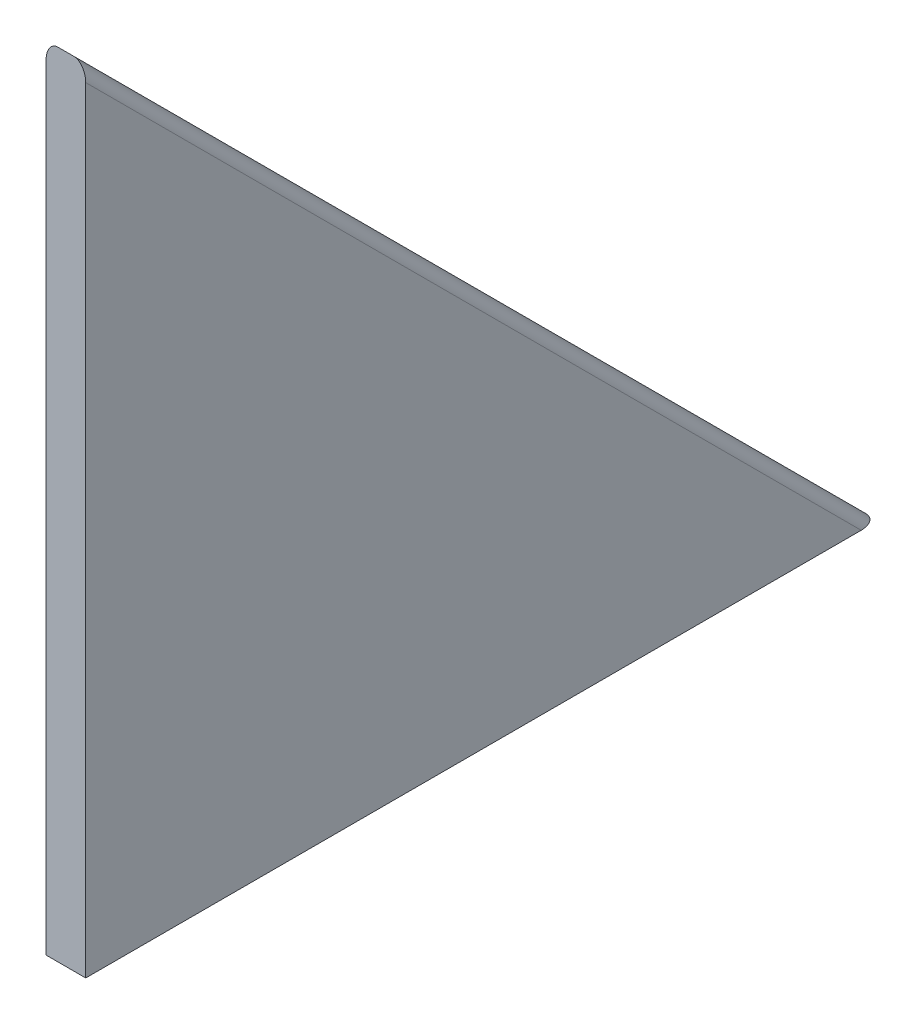
ISO-10303-21;
HEADER;
FILE_DESCRIPTION(('STEP AP214'),'2;1');
FILE_NAME('part.step','',(''),(''),'','','');
FILE_SCHEMA(('AUTOMOTIVE_DESIGN { 1 0 10303 214 1 1 1 1 }'));
ENDSEC;
DATA;
#1=APPLICATION_CONTEXT('core data for automotive mechanical design processes');
#2=APPLICATION_PROTOCOL_DEFINITION('international standard','automotive_design',2000,#1);
#3=PRODUCT_CONTEXT('',#1,'mechanical');
#4=PRODUCT('Part','Part','',(#3));
#5=PRODUCT_RELATED_PRODUCT_CATEGORY('part','',(#4));
#6=PRODUCT_DEFINITION_FORMATION('','',#4);
#7=PRODUCT_DEFINITION_CONTEXT('part definition',#1,'design');
#8=PRODUCT_DEFINITION('design','',#6,#7);
#9=PRODUCT_DEFINITION_SHAPE('','',#8);
#10=(LENGTH_UNIT() NAMED_UNIT(*) SI_UNIT(.MILLI.,.METRE.));
#11=(NAMED_UNIT(*) PLANE_ANGLE_UNIT() SI_UNIT($,.RADIAN.));
#12=(NAMED_UNIT(*) SI_UNIT($,.STERADIAN.) SOLID_ANGLE_UNIT());
#13=UNCERTAINTY_MEASURE_WITH_UNIT(LENGTH_MEASURE(1.E-05),#10,'distance_accuracy_value','');
#14=(GEOMETRIC_REPRESENTATION_CONTEXT(3) GLOBAL_UNCERTAINTY_ASSIGNED_CONTEXT((#13)) GLOBAL_UNIT_ASSIGNED_CONTEXT((#10,
#11,#12)) REPRESENTATION_CONTEXT('',''));
#15=CARTESIAN_POINT('',(0.,0.,0.));
#16=DIRECTION('',(0.,0.,1.));
#17=DIRECTION('',(1.,0.,0.));
#18=AXIS2_PLACEMENT_3D('',#15,#16,#17);
#19=CARTESIAN_POINT('',(-10.,-200.,0.));
#20=DIRECTION('',(0.,0.,1.));
#21=DIRECTION('',(1.,0.,0.));
#22=AXIS2_PLACEMENT_3D('',#19,#20,#21);
#23=PLANE('',#22);
#24=DIRECTION('',(1.,0.,0.));
#25=VECTOR('',#24,1.);
#26=CARTESIAN_POINT('',(-10.,0.,0.));
#27=LINE('',#26,#25);
#28=CARTESIAN_POINT('',(-7.,0.,0.));
#29=VERTEX_POINT('',#28);
#30=CARTESIAN_POINT('',(-3.,0.,0.));
#31=VERTEX_POINT('',#30);
#32=EDGE_CURVE('E120',#29,#31,#27,.T.);
#33=ORIENTED_EDGE('',*,*,#32,.F.);
#34=CARTESIAN_POINT('',(-7.,-4.24264068711929,0.));
#35=DIRECTION('',(0.,0.,1.));
#36=DIRECTION('',(0.,-1.,0.));
#37=AXIS2_PLACEMENT_3D('',#34,#35,#36);
#38=ELLIPSE('',#37,4.24264068711928,3.);
#39=CARTESIAN_POINT('',(-10.,-4.24264068711927,0.));
#40=VERTEX_POINT('',#39);
#41=EDGE_CURVE('E100',#29,#40,#38,.T.);
#42=ORIENTED_EDGE('',*,*,#41,.T.);
#43=DIRECTION('',(0.,-1.,0.));
#44=VECTOR('',#43,1.);
#45=CARTESIAN_POINT('',(-10.,-200.,0.));
#46=LINE('',#45,#44);
#47=CARTESIAN_POINT('',(-10.,-200.,0.));
#48=VERTEX_POINT('',#47);
#49=EDGE_CURVE('E95',#40,#48,#46,.T.);
#50=ORIENTED_EDGE('',*,*,#49,.T.);
#51=DIRECTION('',(1.,0.,0.));
#52=VECTOR('',#51,1.);
#53=CARTESIAN_POINT('',(-10.,-200.,0.));
#54=LINE('',#53,#52);
#55=CARTESIAN_POINT('',(0.,-200.,0.));
#56=VERTEX_POINT('',#55);
#57=EDGE_CURVE('E99',#48,#56,#54,.T.);
#58=ORIENTED_EDGE('',*,*,#57,.T.);
#59=DIRECTION('',(0.,-1.,0.));
#60=VECTOR('',#59,1.);
#61=CARTESIAN_POINT('',(0.,-200.,0.));
#62=LINE('',#61,#60);
#63=CARTESIAN_POINT('',(0.,-4.24264068711927,0.));
#64=VERTEX_POINT('',#63);
#65=EDGE_CURVE('E115',#64,#56,#62,.T.);
#66=ORIENTED_EDGE('',*,*,#65,.F.);
#67=CARTESIAN_POINT('',(-3.,-4.24264068711928,0.));
#68=DIRECTION('',(0.,0.,1.));
#69=DIRECTION('',(0.,1.,0.));
#70=AXIS2_PLACEMENT_3D('',#67,#68,#69);
#71=ELLIPSE('',#70,4.24264068711928,3.);
#72=EDGE_CURVE('E133',#64,#31,#71,.T.);
#73=ORIENTED_EDGE('',*,*,#72,.T.);
#74=EDGE_LOOP('',(#33,#42,#50,#58,#66,#73));
#75=FACE_BOUND('',#74,.T.);
#76=ADVANCED_FACE('F44',(#75),#23,.T.);
#77=CARTESIAN_POINT('',(-10.,0.,0.));
#78=DIRECTION('',(0.,0.707106781186548,-0.707106781186548));
#79=DIRECTION('',(0.,0.707106781186548,0.707106781186548));
#80=AXIS2_PLACEMENT_3D('',#77,#78,#79);
#81=PLANE('',#80);
#82=DIRECTION('',(1.,0.,0.));
#83=VECTOR('',#82,1.);
#84=CARTESIAN_POINT('',(-10.,-200.,-200.));
#85=LINE('',#84,#83);
#86=CARTESIAN_POINT('',(-7.,-200.,-200.));
#87=VERTEX_POINT('',#86);
#88=CARTESIAN_POINT('',(-3.,-200.,-200.));
#89=VERTEX_POINT('',#88);
#90=EDGE_CURVE('E108',#87,#89,#85,.T.);
#91=ORIENTED_EDGE('',*,*,#90,.F.);
#92=DIRECTION('',(0.,0.707106781186548,0.707106781186548));
#93=VECTOR('',#92,1.);
#94=CARTESIAN_POINT('',(-7.,0.,0.));
#95=LINE('',#94,#93);
#96=EDGE_CURVE('E129',#87,#29,#95,.T.);
#97=ORIENTED_EDGE('',*,*,#96,.T.);
#98=ORIENTED_EDGE('',*,*,#32,.T.);
#99=DIRECTION('',(0.,0.707106781186548,0.707106781186548));
#100=VECTOR('',#99,1.);
#101=CARTESIAN_POINT('',(-3.,0.,0.));
#102=LINE('',#101,#100);
#103=EDGE_CURVE('E124',#31,#89,#102,.F.);
#104=ORIENTED_EDGE('',*,*,#103,.T.);
#105=EDGE_LOOP('',(#91,#97,#98,#104));
#106=FACE_BOUND('',#105,.T.);
#107=ADVANCED_FACE('F147',(#106),#81,.T.);
#108=CARTESIAN_POINT('',(-10.,-200.,-200.));
#109=DIRECTION('',(0.,-1.,0.));
#110=DIRECTION('',(0.,0.,-1.));
#111=AXIS2_PLACEMENT_3D('',#108,#109,#110);
#112=PLANE('',#111);
#113=DIRECTION('',(0.,0.,-1.));
#114=VECTOR('',#113,1.);
#115=CARTESIAN_POINT('',(-10.,-200.,-200.));
#116=LINE('',#115,#114);
#117=CARTESIAN_POINT('',(-10.,-200.,-195.757359312881));
#118=VERTEX_POINT('',#117);
#119=EDGE_CURVE('E102',#48,#118,#116,.T.);
#120=ORIENTED_EDGE('',*,*,#119,.T.);
#121=CARTESIAN_POINT('',(-7.,-200.,-195.757359312881));
#122=DIRECTION('',(0.,-1.,0.));
#123=DIRECTION('',(0.,0.,-1.));
#124=AXIS2_PLACEMENT_3D('',#121,#122,#123);
#125=ELLIPSE('',#124,4.24264068711928,3.);
#126=EDGE_CURVE('E53',#118,#87,#125,.T.);
#127=ORIENTED_EDGE('',*,*,#126,.T.);
#128=ORIENTED_EDGE('',*,*,#90,.T.);
#129=CARTESIAN_POINT('',(-3.,-200.,-195.757359312881));
#130=DIRECTION('',(0.,-1.,0.));
#131=DIRECTION('',(0.,0.,1.));
#132=AXIS2_PLACEMENT_3D('',#129,#130,#131);
#133=ELLIPSE('',#132,4.24264068711928,3.);
#134=CARTESIAN_POINT('',(0.,-200.,-195.757359312881));
#135=VERTEX_POINT('',#134);
#136=EDGE_CURVE('E60',#89,#135,#133,.T.);
#137=ORIENTED_EDGE('',*,*,#136,.T.);
#138=DIRECTION('',(0.,0.,-1.));
#139=VECTOR('',#138,1.);
#140=CARTESIAN_POINT('',(0.,-200.,-200.));
#141=LINE('',#140,#139);
#142=EDGE_CURVE('E103',#56,#135,#141,.T.);
#143=ORIENTED_EDGE('',*,*,#142,.F.);
#144=ORIENTED_EDGE('',*,*,#57,.F.);
#145=EDGE_LOOP('',(#120,#127,#128,#137,#143,#144));
#146=FACE_BOUND('',#145,.T.);
#147=ADVANCED_FACE('F105',(#146),#112,.T.);
#148=CARTESIAN_POINT('',(-10.,0.,0.));
#149=DIRECTION('',(1.,0.,0.));
#150=DIRECTION('',(0.,0.,-1.));
#151=AXIS2_PLACEMENT_3D('',#148,#149,#150);
#152=PLANE('',#151);
#153=ORIENTED_EDGE('',*,*,#49,.F.);
#154=DIRECTION('',(0.,0.707106781186548,0.707106781186548));
#155=VECTOR('',#154,1.);
#156=CARTESIAN_POINT('',(-10.,-202.12132034356,-197.87867965644));
#157=LINE('',#156,#155);
#158=EDGE_CURVE('E68',#40,#118,#157,.F.);
#159=ORIENTED_EDGE('',*,*,#158,.T.);
#160=ORIENTED_EDGE('',*,*,#119,.F.);
#161=EDGE_LOOP('',(#153,#159,#160));
#162=FACE_BOUND('',#161,.T.);
#163=ADVANCED_FACE('F110',(#162),#152,.F.);
#164=CARTESIAN_POINT('',(0.,0.,0.));
#165=DIRECTION('',(1.,0.,0.));
#166=DIRECTION('',(0.,0.,-1.));
#167=AXIS2_PLACEMENT_3D('',#164,#165,#166);
#168=PLANE('',#167);
#169=ORIENTED_EDGE('',*,*,#142,.T.);
#170=DIRECTION('',(0.,0.707106781186548,0.707106781186548));
#171=VECTOR('',#170,1.);
#172=CARTESIAN_POINT('',(0.,-2.12132034355964,2.12132034355964));
#173=LINE('',#172,#171);
#174=EDGE_CURVE('E11',#135,#64,#173,.T.);
#175=ORIENTED_EDGE('',*,*,#174,.T.);
#176=ORIENTED_EDGE('',*,*,#65,.T.);
#177=EDGE_LOOP('',(#169,#175,#176));
#178=FACE_BOUND('',#177,.T.);
#179=ADVANCED_FACE('F151',(#178),#168,.T.);
#180=CARTESIAN_POINT('',(-7.,-2.12132034355964,2.12132034355964));
#181=DIRECTION('',(0.,-0.707106781186548,-0.707106781186548));
#182=DIRECTION('',(0.,0.707106781186548,-0.707106781186548));
#183=AXIS2_PLACEMENT_3D('',#180,#181,#182);
#184=CYLINDRICAL_SURFACE('',#183,3.);
#185=ORIENTED_EDGE('',*,*,#126,.F.);
#186=ORIENTED_EDGE('',*,*,#158,.F.);
#187=ORIENTED_EDGE('',*,*,#41,.F.);
#188=ORIENTED_EDGE('',*,*,#96,.F.);
#189=EDGE_LOOP('',(#185,#186,#187,#188));
#190=FACE_BOUND('',#189,.T.);
#191=ADVANCED_FACE('F149',(#190),#184,.T.);
#192=CARTESIAN_POINT('',(-3.,-2.12132034355964,2.12132034355964));
#193=DIRECTION('',(0.,0.707106781186548,0.707106781186548));
#194=DIRECTION('',(0.,-0.707106781186548,0.707106781186548));
#195=AXIS2_PLACEMENT_3D('',#192,#193,#194);
#196=CYLINDRICAL_SURFACE('',#195,3.);
#197=ORIENTED_EDGE('',*,*,#136,.F.);
#198=ORIENTED_EDGE('',*,*,#103,.F.);
#199=ORIENTED_EDGE('',*,*,#72,.F.);
#200=ORIENTED_EDGE('',*,*,#174,.F.);
#201=EDGE_LOOP('',(#197,#198,#199,#200));
#202=FACE_BOUND('',#201,.T.);
#203=ADVANCED_FACE('F46',(#202),#196,.T.);
#204=CLOSED_SHELL('',(#76,#107,#147,#163,#179,#191,#203));
#205=MANIFOLD_SOLID_BREP('B2',#204);
#206=ADVANCED_BREP_SHAPE_REPRESENTATION('',(#18,#205),#14);
#207=SHAPE_DEFINITION_REPRESENTATION(#9,#206);
ENDSEC;
END-ISO-10303-21;
